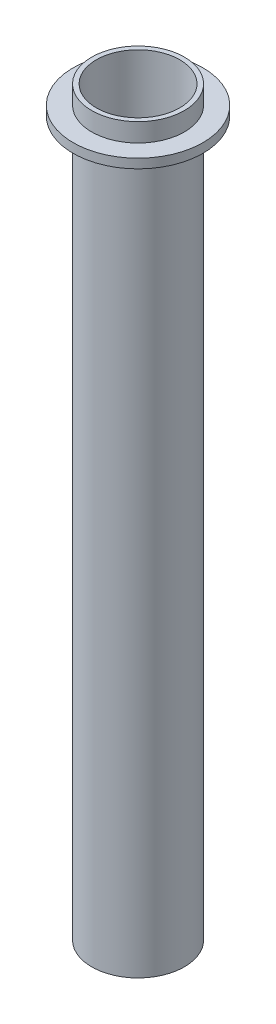
ISO-10303-21;
HEADER;
FILE_DESCRIPTION(('STEP AP214'),'2;1');
FILE_NAME('part.step','',(''),(''),'','','');
FILE_SCHEMA(('AUTOMOTIVE_DESIGN { 1 0 10303 214 1 1 1 1 }'));
ENDSEC;
DATA;
#1=APPLICATION_CONTEXT('core data for automotive mechanical design processes');
#2=APPLICATION_PROTOCOL_DEFINITION('international standard','automotive_design',2000,#1);
#3=PRODUCT_CONTEXT('',#1,'mechanical');
#4=PRODUCT('Part','Part','',(#3));
#5=PRODUCT_RELATED_PRODUCT_CATEGORY('part','',(#4));
#6=PRODUCT_DEFINITION_FORMATION('','',#4);
#7=PRODUCT_DEFINITION_CONTEXT('part definition',#1,'design');
#8=PRODUCT_DEFINITION('design','',#6,#7);
#9=PRODUCT_DEFINITION_SHAPE('','',#8);
#10=(LENGTH_UNIT() NAMED_UNIT(*) SI_UNIT(.MILLI.,.METRE.));
#11=(NAMED_UNIT(*) PLANE_ANGLE_UNIT() SI_UNIT($,.RADIAN.));
#12=(NAMED_UNIT(*) SI_UNIT($,.STERADIAN.) SOLID_ANGLE_UNIT());
#13=UNCERTAINTY_MEASURE_WITH_UNIT(LENGTH_MEASURE(1.E-05),#10,'distance_accuracy_value','');
#14=(GEOMETRIC_REPRESENTATION_CONTEXT(3) GLOBAL_UNCERTAINTY_ASSIGNED_CONTEXT((#13)) GLOBAL_UNIT_ASSIGNED_CONTEXT((#10,
#11,#12)) REPRESENTATION_CONTEXT('',''));
#15=CARTESIAN_POINT('',(0.,0.,0.));
#16=DIRECTION('',(0.,0.,1.));
#17=DIRECTION('',(1.,0.,0.));
#18=AXIS2_PLACEMENT_3D('',#15,#16,#17);
#19=CARTESIAN_POINT('',(0.,0.,0.));
#20=DIRECTION('',(0.,-1.,0.));
#21=DIRECTION('',(0.,0.,-1.));
#22=AXIS2_PLACEMENT_3D('',#19,#20,#21);
#23=CYLINDRICAL_SURFACE('',#22,7.9375);
#24=CARTESIAN_POINT('',(0.,123.825,0.));
#25=DIRECTION('',(0.,-1.,0.));
#26=DIRECTION('',(0.,0.,-1.));
#27=AXIS2_PLACEMENT_3D('',#24,#25,#26);
#28=CIRCLE('',#27,7.9375);
#29=CARTESIAN_POINT('',(0.,123.825,-7.9375));
#30=VERTEX_POINT('',#29);
#31=EDGE_CURVE('E10',#30,#30,#28,.T.);
#32=ORIENTED_EDGE('',*,*,#31,.F.);
#33=EDGE_LOOP('',(#32));
#34=FACE_BOUND('',#33,.T.);
#35=CARTESIAN_POINT('',(0.,127.,0.));
#36=DIRECTION('',(0.,-1.,0.));
#37=DIRECTION('',(0.,0.,-1.));
#38=AXIS2_PLACEMENT_3D('',#35,#36,#37);
#39=CIRCLE('',#38,7.9375);
#40=CARTESIAN_POINT('',(0.,127.,-7.9375));
#41=VERTEX_POINT('',#40);
#42=EDGE_CURVE('E56',#41,#41,#39,.T.);
#43=ORIENTED_EDGE('',*,*,#42,.T.);
#44=EDGE_LOOP('',(#43));
#45=FACE_BOUND('',#44,.T.);
#46=ADVANCED_FACE('F28',(#34,#45),#23,.T.);
#47=CARTESIAN_POINT('',(-7.9375,123.825,0.));
#48=DIRECTION('',(0.,-1.,0.));
#49=DIRECTION('',(0.,0.,-1.));
#50=AXIS2_PLACEMENT_3D('',#47,#48,#49);
#51=PLANE('',#50);
#52=CARTESIAN_POINT('',(0.,123.825,0.));
#53=DIRECTION('',(0.,-1.,0.));
#54=DIRECTION('',(0.,0.,-1.));
#55=AXIS2_PLACEMENT_3D('',#52,#53,#54);
#56=CIRCLE('',#55,11.1125);
#57=CARTESIAN_POINT('',(0.,123.825,-11.1125));
#58=VERTEX_POINT('',#57);
#59=EDGE_CURVE('E34',#58,#58,#56,.T.);
#60=ORIENTED_EDGE('',*,*,#59,.F.);
#61=EDGE_LOOP('',(#60));
#62=FACE_BOUND('',#61,.T.);
#63=ORIENTED_EDGE('',*,*,#31,.T.);
#64=EDGE_LOOP('',(#63));
#65=FACE_BOUND('',#64,.T.);
#66=ADVANCED_FACE('F93',(#62,#65),#51,.F.);
#67=CARTESIAN_POINT('',(0.,0.,0.));
#68=DIRECTION('',(0.,-1.,0.));
#69=DIRECTION('',(0.,0.,-1.));
#70=AXIS2_PLACEMENT_3D('',#67,#68,#69);
#71=CYLINDRICAL_SURFACE('',#70,11.1125);
#72=CARTESIAN_POINT('',(0.,122.2375,0.));
#73=DIRECTION('',(0.,-1.,0.));
#74=DIRECTION('',(0.,0.,-1.));
#75=AXIS2_PLACEMENT_3D('',#72,#73,#74);
#76=CIRCLE('',#75,11.1125);
#77=CARTESIAN_POINT('',(0.,122.2375,-11.1125));
#78=VERTEX_POINT('',#77);
#79=EDGE_CURVE('E38',#78,#78,#76,.T.);
#80=ORIENTED_EDGE('',*,*,#79,.F.);
#81=EDGE_LOOP('',(#80));
#82=FACE_BOUND('',#81,.T.);
#83=ORIENTED_EDGE('',*,*,#59,.T.);
#84=EDGE_LOOP('',(#83));
#85=FACE_BOUND('',#84,.T.);
#86=ADVANCED_FACE('F88',(#82,#85),#71,.T.);
#87=CARTESIAN_POINT('',(-11.1125,122.2375,0.));
#88=DIRECTION('',(0.,1.,0.));
#89=DIRECTION('',(0.,0.,1.));
#90=AXIS2_PLACEMENT_3D('',#87,#88,#89);
#91=PLANE('',#90);
#92=CARTESIAN_POINT('',(0.,122.2375,0.));
#93=DIRECTION('',(0.,-1.,0.));
#94=DIRECTION('',(0.,0.,-1.));
#95=AXIS2_PLACEMENT_3D('',#92,#93,#94);
#96=CIRCLE('',#95,7.9375);
#97=CARTESIAN_POINT('',(0.,122.2375,-7.9375));
#98=VERTEX_POINT('',#97);
#99=EDGE_CURVE('E42',#98,#98,#96,.T.);
#100=ORIENTED_EDGE('',*,*,#99,.F.);
#101=EDGE_LOOP('',(#100));
#102=FACE_BOUND('',#101,.T.);
#103=ORIENTED_EDGE('',*,*,#79,.T.);
#104=EDGE_LOOP('',(#103));
#105=FACE_BOUND('',#104,.T.);
#106=ADVANCED_FACE('F82',(#102,#105),#91,.F.);
#107=CARTESIAN_POINT('',(0.,0.,0.));
#108=DIRECTION('',(0.,-1.,0.));
#109=DIRECTION('',(0.,0.,-1.));
#110=AXIS2_PLACEMENT_3D('',#107,#108,#109);
#111=CYLINDRICAL_SURFACE('',#110,7.9375);
#112=CARTESIAN_POINT('',(0.,0.,0.));
#113=DIRECTION('',(0.,-1.,0.));
#114=DIRECTION('',(0.,0.,-1.));
#115=AXIS2_PLACEMENT_3D('',#112,#113,#114);
#116=CIRCLE('',#115,7.9375);
#117=CARTESIAN_POINT('',(0.,0.,-7.9375));
#118=VERTEX_POINT('',#117);
#119=EDGE_CURVE('E47',#118,#118,#116,.T.);
#120=ORIENTED_EDGE('',*,*,#119,.F.);
#121=EDGE_LOOP('',(#120));
#122=FACE_BOUND('',#121,.T.);
#123=ORIENTED_EDGE('',*,*,#99,.T.);
#124=EDGE_LOOP('',(#123));
#125=FACE_BOUND('',#124,.T.);
#126=ADVANCED_FACE('F76',(#122,#125),#111,.T.);
#127=CARTESIAN_POINT('',(-7.14375,0.,0.));
#128=DIRECTION('',(0.,1.,0.));
#129=DIRECTION('',(0.,0.,1.));
#130=AXIS2_PLACEMENT_3D('',#127,#128,#129);
#131=PLANE('',#130);
#132=CARTESIAN_POINT('',(0.,0.,0.));
#133=DIRECTION('',(0.,-1.,0.));
#134=DIRECTION('',(0.,0.,-1.));
#135=AXIS2_PLACEMENT_3D('',#132,#133,#134);
#136=CIRCLE('',#135,7.14375);
#137=CARTESIAN_POINT('',(0.,0.,-7.14375));
#138=VERTEX_POINT('',#137);
#139=EDGE_CURVE('E50',#138,#138,#136,.T.);
#140=ORIENTED_EDGE('',*,*,#139,.F.);
#141=EDGE_LOOP('',(#140));
#142=FACE_BOUND('',#141,.T.);
#143=ORIENTED_EDGE('',*,*,#119,.T.);
#144=EDGE_LOOP('',(#143));
#145=FACE_BOUND('',#144,.T.);
#146=ADVANCED_FACE('F70',(#142,#145),#131,.F.);
#147=CARTESIAN_POINT('',(0.,0.,0.));
#148=DIRECTION('',(0.,-1.,0.));
#149=DIRECTION('',(0.,0.,-1.));
#150=AXIS2_PLACEMENT_3D('',#147,#148,#149);
#151=CYLINDRICAL_SURFACE('',#150,7.14375);
#152=CARTESIAN_POINT('',(0.,127.,0.));
#153=DIRECTION('',(0.,-1.,0.));
#154=DIRECTION('',(0.,0.,-1.));
#155=AXIS2_PLACEMENT_3D('',#152,#153,#154);
#156=CIRCLE('',#155,7.14375);
#157=CARTESIAN_POINT('',(0.,127.,-7.14375));
#158=VERTEX_POINT('',#157);
#159=EDGE_CURVE('E53',#158,#158,#156,.T.);
#160=ORIENTED_EDGE('',*,*,#159,.F.);
#161=EDGE_LOOP('',(#160));
#162=FACE_BOUND('',#161,.T.);
#163=ORIENTED_EDGE('',*,*,#139,.T.);
#164=EDGE_LOOP('',(#163));
#165=FACE_BOUND('',#164,.T.);
#166=ADVANCED_FACE('F64',(#162,#165),#151,.F.);
#167=CARTESIAN_POINT('',(-7.14375,127.,0.));
#168=DIRECTION('',(0.,-1.,0.));
#169=DIRECTION('',(0.,0.,-1.));
#170=AXIS2_PLACEMENT_3D('',#167,#168,#169);
#171=PLANE('',#170);
#172=ORIENTED_EDGE('',*,*,#42,.F.);
#173=EDGE_LOOP('',(#172));
#174=FACE_BOUND('',#173,.T.);
#175=ORIENTED_EDGE('',*,*,#159,.T.);
#176=EDGE_LOOP('',(#175));
#177=FACE_BOUND('',#176,.T.);
#178=ADVANCED_FACE('F61',(#174,#177),#171,.F.);
#179=CLOSED_SHELL('',(#46,#66,#86,#106,#126,#146,#166,#178));
#180=MANIFOLD_SOLID_BREP('B2',#179);
#181=ADVANCED_BREP_SHAPE_REPRESENTATION('',(#18,#180),#14);
#182=SHAPE_DEFINITION_REPRESENTATION(#9,#181);
ENDSEC;
END-ISO-10303-21;
